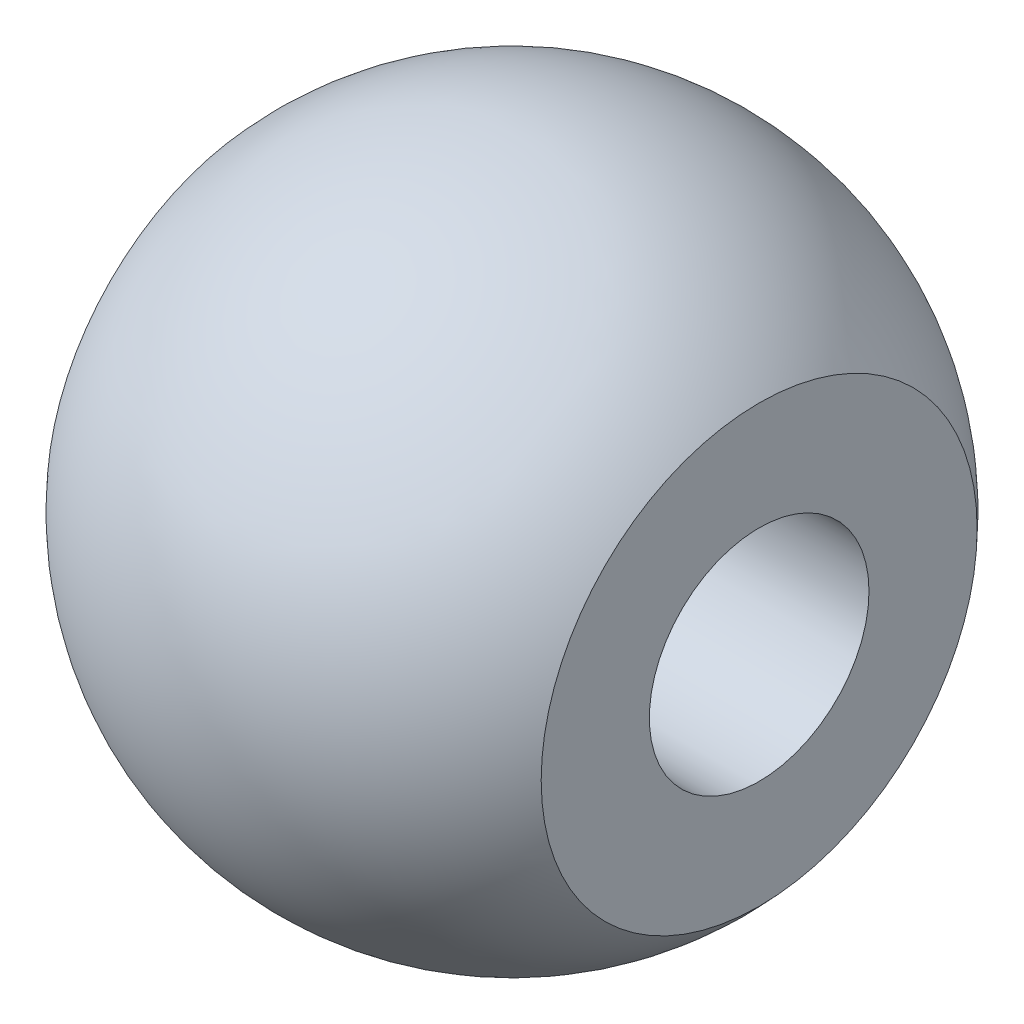
ISO-10303-21;
HEADER;
FILE_DESCRIPTION(('STEP AP214'),'2;1');
FILE_NAME('part.step','',(''),(''),'','','');
FILE_SCHEMA(('AUTOMOTIVE_DESIGN { 1 0 10303 214 1 1 1 1 }'));
ENDSEC;
DATA;
#1=APPLICATION_CONTEXT('core data for automotive mechanical design processes');
#2=APPLICATION_PROTOCOL_DEFINITION('international standard','automotive_design',2000,#1);
#3=PRODUCT_CONTEXT('',#1,'mechanical');
#4=PRODUCT('Part','Part','',(#3));
#5=PRODUCT_RELATED_PRODUCT_CATEGORY('part','',(#4));
#6=PRODUCT_DEFINITION_FORMATION('','',#4);
#7=PRODUCT_DEFINITION_CONTEXT('part definition',#1,'design');
#8=PRODUCT_DEFINITION('design','',#6,#7);
#9=PRODUCT_DEFINITION_SHAPE('','',#8);
#10=(LENGTH_UNIT() NAMED_UNIT(*) SI_UNIT(.MILLI.,.METRE.));
#11=(NAMED_UNIT(*) PLANE_ANGLE_UNIT() SI_UNIT($,.RADIAN.));
#12=(NAMED_UNIT(*) SI_UNIT($,.STERADIAN.) SOLID_ANGLE_UNIT());
#13=UNCERTAINTY_MEASURE_WITH_UNIT(LENGTH_MEASURE(1.E-05),#10,'distance_accuracy_value','');
#14=(GEOMETRIC_REPRESENTATION_CONTEXT(3) GLOBAL_UNCERTAINTY_ASSIGNED_CONTEXT((#13)) GLOBAL_UNIT_ASSIGNED_CONTEXT((#10,
#11,#12)) REPRESENTATION_CONTEXT('',''));
#15=CARTESIAN_POINT('',(0.,0.,0.));
#16=DIRECTION('',(0.,0.,1.));
#17=DIRECTION('',(1.,0.,0.));
#18=AXIS2_PLACEMENT_3D('',#15,#16,#17);
#19=CARTESIAN_POINT('',(4.5,0.,0.));
#20=DIRECTION('',(1.,0.,0.));
#21=DIRECTION('',(0.,1.,0.));
#22=AXIS2_PLACEMENT_3D('',#19,#20,#21);
#23=SPHERICAL_SURFACE('',#22,6.);
#24=CARTESIAN_POINT('',(0.,0.,0.));
#25=DIRECTION('',(1.,0.,0.));
#26=DIRECTION('',(0.,0.,-1.));
#27=AXIS2_PLACEMENT_3D('',#24,#25,#26);
#28=CIRCLE('',#27,3.96862696659689);
#29=CARTESIAN_POINT('',(0.,3.96862696659689,0.));
#30=VERTEX_POINT('',#29);
#31=EDGE_CURVE('E57',#30,#30,#28,.T.);
#32=CARTESIAN_POINT('',(9.,0.,0.));
#33=DIRECTION('',(1.,0.,0.));
#34=DIRECTION('',(0.,0.,-1.));
#35=AXIS2_PLACEMENT_3D('',#32,#33,#34);
#36=CIRCLE('',#35,3.96862696659689);
#37=CARTESIAN_POINT('',(9.,3.96862696659689,0.));
#38=VERTEX_POINT('',#37);
#39=EDGE_CURVE('E10',#38,#38,#36,.T.);
#40=CARTESIAN_POINT('',(0.,3.96862696659689,0.));
#41=CARTESIAN_POINT('',(0.0701155158263286,4.04813476780701,0.));
#42=CARTESIAN_POINT('',(0.142342088294678,4.12578044526497,0.));
#43=CARTESIAN_POINT('',(0.290805596136343,4.27713817883407,0.));
#44=CARTESIAN_POINT('',(0.367042531509657,4.35085023494521,0.));
#45=CARTESIAN_POINT('',(0.523315014782175,4.4941313519782,0.));
#46=CARTESIAN_POINT('',(0.603350562681378,4.56370041290005,0.));
#47=CARTESIAN_POINT('',(0.766994833047713,4.69850076282096,0.));
#48=CARTESIAN_POINT('',(0.850603555514846,4.76373205182003,0.));
#49=CARTESIAN_POINT('',(1.02115950961961,4.88967347164259,0.));
#50=CARTESIAN_POINT('',(1.10810674125724,4.9503836024661,0.));
#51=CARTESIAN_POINT('',(1.28509545455799,5.06711223105534,0.));
#52=CARTESIAN_POINT('',(1.3751369362211,5.12313072882108,0.));
#53=CARTESIAN_POINT('',(1.55806125750585,5.23031873710099,0.));
#54=CARTESIAN_POINT('',(1.65094409712748,5.28148824761517,0.));
#55=CARTESIAN_POINT('',(1.83929024602968,5.37883456206912,0.));
#56=CARTESIAN_POINT('',(1.93475355531024,5.42501136600891,0.));
#57=CARTESIAN_POINT('',(2.12799251149599,5.51224256718486,0.));
#58=CARTESIAN_POINT('',(2.22576815840119,5.55329696442104,0.));
#59=CARTESIAN_POINT('',(2.42335716189824,5.63016804073458,0.));
#60=CARTESIAN_POINT('',(2.5231705184901,5.66598471981195,0.));
#61=CARTESIAN_POINT('',(2.72455459029734,5.73227975951892,0.));
#62=CARTESIAN_POINT('',(2.82612530551273,5.76275812014852,0.));
#63=CARTESIAN_POINT('',(3.03073880743632,5.81829091677091,0.));
#64=CARTESIAN_POINT('',(3.13378159414453,5.8433453527637,0.));
#65=CARTESIAN_POINT('',(3.34104981725839,5.8879599283703,0.));
#66=CARTESIAN_POINT('',(3.44527525366406,5.90752006798411,0.));
#67=CARTESIAN_POINT('',(3.65461603260012,5.94109111122104,0.));
#68=CARTESIAN_POINT('',(3.75973137513051,5.95510201484416,0.));
#69=CARTESIAN_POINT('',(3.97055672321779,5.97753523292316,0.));
#70=CARTESIAN_POINT('',(4.07626672877468,5.98595754737904,0.));
#71=CARTESIAN_POINT('',(4.28798448955438,5.99718993091746,0.));
#72=CARTESIAN_POINT('',(4.39399224477719,6.,0.));
#73=CARTESIAN_POINT('',(4.60600775522281,6.,0.));
#74=CARTESIAN_POINT('',(4.71201551044562,5.99718993091746,0.));
#75=CARTESIAN_POINT('',(4.92373327122532,5.98595754737904,0.));
#76=CARTESIAN_POINT('',(5.02944327678221,5.97753523292316,0.));
#77=CARTESIAN_POINT('',(5.24026862486949,5.95510201484416,0.));
#78=CARTESIAN_POINT('',(5.34538396739988,5.94109111122104,0.));
#79=CARTESIAN_POINT('',(5.55472474633594,5.90752006798411,0.));
#80=CARTESIAN_POINT('',(5.6589501827416,5.8879599283703,0.));
#81=CARTESIAN_POINT('',(5.86621840585547,5.8433453527637,0.));
#82=CARTESIAN_POINT('',(5.96926119256368,5.81829091677091,0.));
#83=CARTESIAN_POINT('',(6.17387469448727,5.76275812014852,0.));
#84=CARTESIAN_POINT('',(6.27544540970266,5.73227975951892,0.));
#85=CARTESIAN_POINT('',(6.4768294815099,5.66598471981195,0.));
#86=CARTESIAN_POINT('',(6.57664283810176,5.63016804073458,0.));
#87=CARTESIAN_POINT('',(6.77423184159881,5.55329696442104,0.));
#88=CARTESIAN_POINT('',(6.87200748850401,5.51224256718486,0.));
#89=CARTESIAN_POINT('',(7.06524644468976,5.42501136600891,0.));
#90=CARTESIAN_POINT('',(7.16070975397032,5.37883456206912,0.));
#91=CARTESIAN_POINT('',(7.34905590287252,5.28148824761517,0.));
#92=CARTESIAN_POINT('',(7.44193874249415,5.23031873710099,0.));
#93=CARTESIAN_POINT('',(7.6248630637789,5.12313072882108,0.));
#94=CARTESIAN_POINT('',(7.71490454544201,5.06711223105534,0.));
#95=CARTESIAN_POINT('',(7.89189325874275,4.9503836024661,0.));
#96=CARTESIAN_POINT('',(7.97884049038039,4.8896734716426,0.));
#97=CARTESIAN_POINT('',(8.14939644448515,4.76373205182003,0.));
#98=CARTESIAN_POINT('',(8.23300516695229,4.69850076282096,0.));
#99=CARTESIAN_POINT('',(8.39664943731862,4.56370041290005,0.));
#100=CARTESIAN_POINT('',(8.47668498521782,4.4941313519782,0.));
#101=CARTESIAN_POINT('',(8.63295746849034,4.35085023494521,0.));
#102=CARTESIAN_POINT('',(8.70919440386366,4.27713817883407,0.));
#103=CARTESIAN_POINT('',(8.85765791170532,4.12578044526497,0.));
#104=CARTESIAN_POINT('',(8.92988448417367,4.04813476780701,0.));
#105=CARTESIAN_POINT('',(9.,3.96862696659689,0.));
#106=B_SPLINE_CURVE_WITH_KNOTS('',3,(#40,#41,#42,#43,#44,#45,#46,#47,#48,#49,#50,#51,#52,#53,
#54,#55,#56,#57,#58,#59,#60,#61,#62,#63,#64,#65,#66,#67,#68,#69,#70,#71,#72,#73,#74,#75,#76,#77,
#78,#79,#80,#81,#82,#83,#84,#85,#86,#87,#88,#89,#90,#91,#92,#93,#94,#95,#96,#97,#98,#99,#100,
#101,#102,#103,#104,#105),.UNSPECIFIED.,.F.,.F.,(4,2,2,2,2,2,2,2,2,2,2,2,2,2,2,2,2,2,2,2,2,2,2,
2,2,2,2,2,2,2,2,2,4),(0.,0.317986053500719,0.635972107001437,0.953958160502156,1.27194421400287,
1.58993026750359,1.90791632100431,2.22590237450503,2.54388842800575,2.86187448150647,
3.17986053500719,3.4978465885079,3.81583264200862,4.13381869550934,4.45180474901006,
4.76979080251078,5.0877768560115,5.40576290951222,5.72374896301293,6.04173501651365,
6.35972107001437,6.67770712351509,6.99569317701581,7.31367923051653,7.63166528401725,
7.94965133751796,8.26763739101868,8.5856234445194,8.90360949802012,9.22159555152083,
9.53958160502155,9.85756765852227,10.175553712023),.UNSPECIFIED.);
#107=EDGE_CURVE('BSEAM38',#30,#38,#106,.T.);
#108=ORIENTED_EDGE('',*,*,#31,.T.);
#109=ORIENTED_EDGE('',*,*,#39,.F.);
#110=ORIENTED_EDGE('',*,*,#107,.T.);
#111=ORIENTED_EDGE('',*,*,#107,.F.);
#112=EDGE_LOOP('',(#108,#110,#109,#111));
#113=FACE_BOUND('',#112,.T.);
#114=ADVANCED_FACE('F38',(#113),#23,.T.);
#115=CARTESIAN_POINT('',(9.,3.96862696659689,0.));
#116=DIRECTION('',(1.,0.,0.));
#117=DIRECTION('',(0.,0.,-1.));
#118=AXIS2_PLACEMENT_3D('',#115,#116,#117);
#119=PLANE('',#118);
#120=ORIENTED_EDGE('',*,*,#39,.T.);
#121=EDGE_LOOP('',(#120));
#122=FACE_BOUND('',#121,.T.);
#123=CARTESIAN_POINT('',(9.,0.,0.));
#124=DIRECTION('',(1.,0.,0.));
#125=DIRECTION('',(0.,0.,-1.));
#126=AXIS2_PLACEMENT_3D('',#123,#124,#125);
#127=CIRCLE('',#126,2.);
#128=CARTESIAN_POINT('',(9.,0.,-2.));
#129=VERTEX_POINT('',#128);
#130=EDGE_CURVE('E44',#129,#129,#127,.T.);
#131=ORIENTED_EDGE('',*,*,#130,.F.);
#132=EDGE_LOOP('',(#131));
#133=FACE_BOUND('',#132,.T.);
#134=ADVANCED_FACE('F75',(#122,#133),#119,.T.);
#135=CARTESIAN_POINT('',(9.,0.,0.));
#136=DIRECTION('',(1.,0.,0.));
#137=DIRECTION('',(0.,0.,-1.));
#138=AXIS2_PLACEMENT_3D('',#135,#136,#137);
#139=CYLINDRICAL_SURFACE('',#138,2.);
#140=ORIENTED_EDGE('',*,*,#130,.T.);
#141=EDGE_LOOP('',(#140));
#142=FACE_BOUND('',#141,.T.);
#143=CARTESIAN_POINT('',(1.,0.,0.));
#144=DIRECTION('',(1.,0.,0.));
#145=DIRECTION('',(0.,0.,-1.));
#146=AXIS2_PLACEMENT_3D('',#143,#144,#145);
#147=CIRCLE('',#146,2.);
#148=CARTESIAN_POINT('',(1.,0.,-2.));
#149=VERTEX_POINT('',#148);
#150=EDGE_CURVE('E48',#149,#149,#147,.T.);
#151=ORIENTED_EDGE('',*,*,#150,.F.);
#152=EDGE_LOOP('',(#151));
#153=FACE_BOUND('',#152,.T.);
#154=ADVANCED_FACE('F71',(#142,#153),#139,.F.);
#155=CARTESIAN_POINT('',(0.,0.,0.));
#156=DIRECTION('',(-1.,0.,0.));
#157=DIRECTION('',(0.,0.,1.));
#158=AXIS2_PLACEMENT_3D('',#155,#156,#157);
#159=CONICAL_SURFACE('',#158,3.73205080756888,1.0471975511966);
#160=ORIENTED_EDGE('',*,*,#150,.T.);
#161=EDGE_LOOP('',(#160));
#162=FACE_BOUND('',#161,.T.);
#163=CARTESIAN_POINT('',(0.,0.,0.));
#164=DIRECTION('',(1.,0.,0.));
#165=DIRECTION('',(0.,0.,-1.));
#166=AXIS2_PLACEMENT_3D('',#163,#164,#165);
#167=CIRCLE('',#166,3.73205080756888);
#168=CARTESIAN_POINT('',(0.,0.,-3.73205080756888));
#169=VERTEX_POINT('',#168);
#170=EDGE_CURVE('E52',#169,#169,#167,.T.);
#171=ORIENTED_EDGE('',*,*,#170,.F.);
#172=EDGE_LOOP('',(#171));
#173=FACE_BOUND('',#172,.T.);
#174=ADVANCED_FACE('F65',(#162,#173),#159,.F.);
#175=CARTESIAN_POINT('',(0.,3.73205080756888,0.));
#176=DIRECTION('',(-1.,0.,0.));
#177=DIRECTION('',(0.,0.,1.));
#178=AXIS2_PLACEMENT_3D('',#175,#176,#177);
#179=PLANE('',#178);
#180=ORIENTED_EDGE('',*,*,#170,.T.);
#181=EDGE_LOOP('',(#180));
#182=FACE_BOUND('',#181,.T.);
#183=ORIENTED_EDGE('',*,*,#31,.F.);
#184=EDGE_LOOP('',(#183));
#185=FACE_BOUND('',#184,.T.);
#186=ADVANCED_FACE('F63',(#182,#185),#179,.T.);
#187=CLOSED_SHELL('',(#114,#134,#154,#174,#186));
#188=MANIFOLD_SOLID_BREP('B2',#187);
#189=ADVANCED_BREP_SHAPE_REPRESENTATION('',(#18,#188),#14);
#190=SHAPE_DEFINITION_REPRESENTATION(#9,#189);
ENDSEC;
END-ISO-10303-21;
